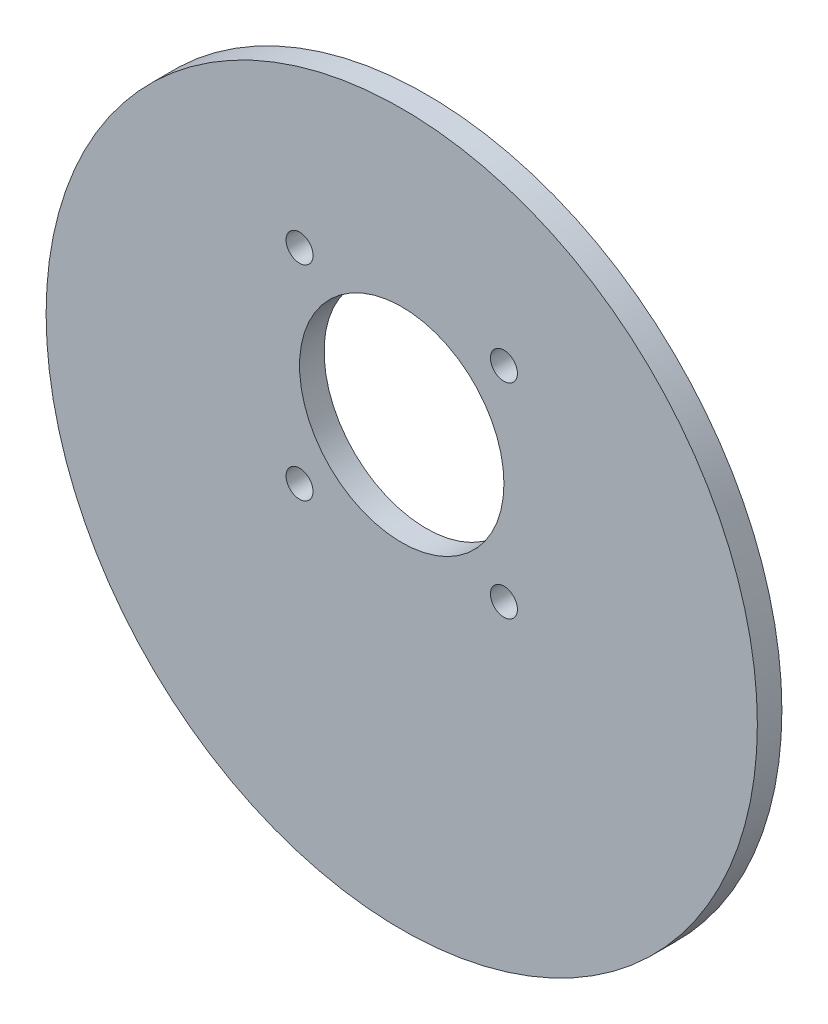
ISO-10303-21;
HEADER;
FILE_DESCRIPTION(('STEP AP214'),'2;1');
FILE_NAME('part.step','',(''),(''),'','','');
FILE_SCHEMA(('AUTOMOTIVE_DESIGN { 1 0 10303 214 1 1 1 1 }'));
ENDSEC;
DATA;
#1=APPLICATION_CONTEXT('core data for automotive mechanical design processes');
#2=APPLICATION_PROTOCOL_DEFINITION('international standard','automotive_design',2000,#1);
#3=PRODUCT_CONTEXT('',#1,'mechanical');
#4=PRODUCT('Part','Part','',(#3));
#5=PRODUCT_RELATED_PRODUCT_CATEGORY('part','',(#4));
#6=PRODUCT_DEFINITION_FORMATION('','',#4);
#7=PRODUCT_DEFINITION_CONTEXT('part definition',#1,'design');
#8=PRODUCT_DEFINITION('design','',#6,#7);
#9=PRODUCT_DEFINITION_SHAPE('','',#8);
#10=(LENGTH_UNIT() NAMED_UNIT(*) SI_UNIT(.MILLI.,.METRE.));
#11=(NAMED_UNIT(*) PLANE_ANGLE_UNIT() SI_UNIT($,.RADIAN.));
#12=(NAMED_UNIT(*) SI_UNIT($,.STERADIAN.) SOLID_ANGLE_UNIT());
#13=UNCERTAINTY_MEASURE_WITH_UNIT(LENGTH_MEASURE(1.E-05),#10,'distance_accuracy_value','');
#14=(GEOMETRIC_REPRESENTATION_CONTEXT(3) GLOBAL_UNCERTAINTY_ASSIGNED_CONTEXT((#13)) GLOBAL_UNIT_ASSIGNED_CONTEXT((#10,
#11,#12)) REPRESENTATION_CONTEXT('',''));
#15=CARTESIAN_POINT('',(0.,0.,0.));
#16=DIRECTION('',(0.,0.,1.));
#17=DIRECTION('',(1.,0.,0.));
#18=AXIS2_PLACEMENT_3D('',#15,#16,#17);
#19=CARTESIAN_POINT('',(0.,0.,3.));
#20=DIRECTION('',(0.,0.,1.));
#21=DIRECTION('',(1.,0.,0.));
#22=AXIS2_PLACEMENT_3D('',#19,#20,#21);
#23=PLANE('',#22);
#24=CARTESIAN_POINT('',(-12.5,22.5,3.));
#25=DIRECTION('',(0.,0.,1.));
#26=DIRECTION('',(1.,0.,0.));
#27=AXIS2_PLACEMENT_3D('',#24,#25,#26);
#28=CIRCLE('',#27,1.64999999999998);
#29=CARTESIAN_POINT('',(-10.85,22.5,3.));
#30=VERTEX_POINT('',#29);
#31=EDGE_CURVE('E73',#30,#30,#28,.T.);
#32=ORIENTED_EDGE('',*,*,#31,.F.);
#33=EDGE_LOOP('',(#32));
#34=FACE_BOUND('',#33,.T.);
#35=CARTESIAN_POINT('',(12.5,-2.50000000000001,3.));
#36=DIRECTION('',(0.,0.,1.));
#37=DIRECTION('',(1.,0.,0.));
#38=AXIS2_PLACEMENT_3D('',#35,#36,#37);
#39=CIRCLE('',#38,1.65000000000001);
#40=CARTESIAN_POINT('',(14.15,-2.50000000000001,3.));
#41=VERTEX_POINT('',#40);
#42=EDGE_CURVE('E61',#41,#41,#39,.T.);
#43=ORIENTED_EDGE('',*,*,#42,.F.);
#44=EDGE_LOOP('',(#43));
#45=FACE_BOUND('',#44,.T.);
#46=CARTESIAN_POINT('',(0.,0.,3.));
#47=DIRECTION('',(0.,0.,1.));
#48=DIRECTION('',(1.,0.,0.));
#49=AXIS2_PLACEMENT_3D('',#46,#47,#48);
#50=CIRCLE('',#49,43.5);
#51=CARTESIAN_POINT('',(43.5,0.,3.));
#52=VERTEX_POINT('',#51);
#53=EDGE_CURVE('E12',#52,#52,#50,.T.);
#54=ORIENTED_EDGE('',*,*,#53,.T.);
#55=EDGE_LOOP('',(#54));
#56=FACE_BOUND('',#55,.T.);
#57=CARTESIAN_POINT('',(-12.5,-2.49999999999999,3.));
#58=DIRECTION('',(0.,0.,1.));
#59=DIRECTION('',(1.,0.,0.));
#60=AXIS2_PLACEMENT_3D('',#57,#58,#59);
#61=CIRCLE('',#60,1.65);
#62=CARTESIAN_POINT('',(-10.85,-2.49999999999999,3.));
#63=VERTEX_POINT('',#62);
#64=EDGE_CURVE('E56',#63,#63,#61,.T.);
#65=ORIENTED_EDGE('',*,*,#64,.F.);
#66=EDGE_LOOP('',(#65));
#67=FACE_BOUND('',#66,.T.);
#68=CARTESIAN_POINT('',(12.5,22.5,3.));
#69=DIRECTION('',(0.,0.,1.));
#70=DIRECTION('',(1.,0.,0.));
#71=AXIS2_PLACEMENT_3D('',#68,#69,#70);
#72=CIRCLE('',#71,1.65);
#73=CARTESIAN_POINT('',(14.15,22.5,3.));
#74=VERTEX_POINT('',#73);
#75=EDGE_CURVE('E67',#74,#74,#72,.T.);
#76=ORIENTED_EDGE('',*,*,#75,.F.);
#77=EDGE_LOOP('',(#76));
#78=FACE_BOUND('',#77,.T.);
#79=CARTESIAN_POINT('',(0.,10.,3.));
#80=DIRECTION('',(0.,0.,1.));
#81=DIRECTION('',(1.,0.,0.));
#82=AXIS2_PLACEMENT_3D('',#79,#80,#81);
#83=CIRCLE('',#82,12.5);
#84=CARTESIAN_POINT('',(12.5,10.,3.));
#85=VERTEX_POINT('',#84);
#86=EDGE_CURVE('E79',#85,#85,#83,.T.);
#87=ORIENTED_EDGE('',*,*,#86,.F.);
#88=EDGE_LOOP('',(#87));
#89=FACE_BOUND('',#88,.T.);
#90=ADVANCED_FACE('F45',(#34,#45,#56,#67,#78,#89),#23,.T.);
#91=CARTESIAN_POINT('',(0.,0.,0.));
#92=DIRECTION('',(0.,0.,1.));
#93=DIRECTION('',(1.,0.,0.));
#94=AXIS2_PLACEMENT_3D('',#91,#92,#93);
#95=PLANE('',#94);
#96=CARTESIAN_POINT('',(0.,0.,0.));
#97=DIRECTION('',(0.,0.,1.));
#98=DIRECTION('',(1.,0.,0.));
#99=AXIS2_PLACEMENT_3D('',#96,#97,#98);
#100=CIRCLE('',#99,43.5);
#101=CARTESIAN_POINT('',(43.5,0.,0.));
#102=VERTEX_POINT('',#101);
#103=EDGE_CURVE('E49',#102,#102,#100,.T.);
#104=ORIENTED_EDGE('',*,*,#103,.F.);
#105=EDGE_LOOP('',(#104));
#106=FACE_BOUND('',#105,.T.);
#107=CARTESIAN_POINT('',(-12.5,-2.49999999999999,0.));
#108=DIRECTION('',(0.,0.,1.));
#109=DIRECTION('',(1.,0.,0.));
#110=AXIS2_PLACEMENT_3D('',#107,#108,#109);
#111=CIRCLE('',#110,1.65);
#112=CARTESIAN_POINT('',(-10.85,-2.49999999999999,0.));
#113=VERTEX_POINT('',#112);
#114=EDGE_CURVE('E58',#113,#113,#111,.T.);
#115=ORIENTED_EDGE('',*,*,#114,.T.);
#116=EDGE_LOOP('',(#115));
#117=FACE_BOUND('',#116,.T.);
#118=CARTESIAN_POINT('',(12.5,-2.50000000000001,0.));
#119=DIRECTION('',(0.,0.,1.));
#120=DIRECTION('',(1.,0.,0.));
#121=AXIS2_PLACEMENT_3D('',#118,#119,#120);
#122=CIRCLE('',#121,1.65000000000001);
#123=CARTESIAN_POINT('',(14.15,-2.50000000000001,0.));
#124=VERTEX_POINT('',#123);
#125=EDGE_CURVE('E64',#124,#124,#122,.T.);
#126=ORIENTED_EDGE('',*,*,#125,.T.);
#127=EDGE_LOOP('',(#126));
#128=FACE_BOUND('',#127,.T.);
#129=CARTESIAN_POINT('',(12.5,22.5,0.));
#130=DIRECTION('',(0.,0.,1.));
#131=DIRECTION('',(1.,0.,0.));
#132=AXIS2_PLACEMENT_3D('',#129,#130,#131);
#133=CIRCLE('',#132,1.65);
#134=CARTESIAN_POINT('',(14.15,22.5,0.));
#135=VERTEX_POINT('',#134);
#136=EDGE_CURVE('E70',#135,#135,#133,.T.);
#137=ORIENTED_EDGE('',*,*,#136,.T.);
#138=EDGE_LOOP('',(#137));
#139=FACE_BOUND('',#138,.T.);
#140=CARTESIAN_POINT('',(-12.5,22.5,0.));
#141=DIRECTION('',(0.,0.,1.));
#142=DIRECTION('',(1.,0.,0.));
#143=AXIS2_PLACEMENT_3D('',#140,#141,#142);
#144=CIRCLE('',#143,1.64999999999998);
#145=CARTESIAN_POINT('',(-10.85,22.5,0.));
#146=VERTEX_POINT('',#145);
#147=EDGE_CURVE('E76',#146,#146,#144,.T.);
#148=ORIENTED_EDGE('',*,*,#147,.T.);
#149=EDGE_LOOP('',(#148));
#150=FACE_BOUND('',#149,.T.);
#151=CARTESIAN_POINT('',(0.,10.,0.));
#152=DIRECTION('',(0.,0.,1.));
#153=DIRECTION('',(1.,0.,0.));
#154=AXIS2_PLACEMENT_3D('',#151,#152,#153);
#155=CIRCLE('',#154,12.5);
#156=CARTESIAN_POINT('',(12.5,10.,0.));
#157=VERTEX_POINT('',#156);
#158=EDGE_CURVE('E82',#157,#157,#155,.T.);
#159=ORIENTED_EDGE('',*,*,#158,.T.);
#160=EDGE_LOOP('',(#159));
#161=FACE_BOUND('',#160,.T.);
#162=ADVANCED_FACE('F92',(#106,#117,#128,#139,#150,#161),#95,.F.);
#163=CARTESIAN_POINT('',(0.,0.,3.));
#164=DIRECTION('',(0.,0.,-1.));
#165=DIRECTION('',(-1.,0.,0.));
#166=AXIS2_PLACEMENT_3D('',#163,#164,#165);
#167=CYLINDRICAL_SURFACE('',#166,43.5);
#168=ORIENTED_EDGE('',*,*,#53,.F.);
#169=EDGE_LOOP('',(#168));
#170=FACE_BOUND('',#169,.T.);
#171=ORIENTED_EDGE('',*,*,#103,.T.);
#172=EDGE_LOOP('',(#171));
#173=FACE_BOUND('',#172,.T.);
#174=ADVANCED_FACE('F47',(#170,#173),#167,.T.);
#175=CARTESIAN_POINT('',(-12.5,-2.49999999999999,3.));
#176=DIRECTION('',(0.,0.,-1.));
#177=DIRECTION('',(-1.,0.,0.));
#178=AXIS2_PLACEMENT_3D('',#175,#176,#177);
#179=CYLINDRICAL_SURFACE('',#178,1.65);
#180=ORIENTED_EDGE('',*,*,#64,.T.);
#181=EDGE_LOOP('',(#180));
#182=FACE_BOUND('',#181,.T.);
#183=ORIENTED_EDGE('',*,*,#114,.F.);
#184=EDGE_LOOP('',(#183));
#185=FACE_BOUND('',#184,.T.);
#186=ADVANCED_FACE('F102',(#182,#185),#179,.F.);
#187=CARTESIAN_POINT('',(12.5,-2.50000000000001,3.));
#188=DIRECTION('',(0.,0.,-1.));
#189=DIRECTION('',(-1.,0.,0.));
#190=AXIS2_PLACEMENT_3D('',#187,#188,#189);
#191=CYLINDRICAL_SURFACE('',#190,1.65000000000001);
#192=ORIENTED_EDGE('',*,*,#42,.T.);
#193=EDGE_LOOP('',(#192));
#194=FACE_BOUND('',#193,.T.);
#195=ORIENTED_EDGE('',*,*,#125,.F.);
#196=EDGE_LOOP('',(#195));
#197=FACE_BOUND('',#196,.T.);
#198=ADVANCED_FACE('F105',(#194,#197),#191,.F.);
#199=CARTESIAN_POINT('',(12.5,22.5,3.));
#200=DIRECTION('',(0.,0.,-1.));
#201=DIRECTION('',(-1.,0.,0.));
#202=AXIS2_PLACEMENT_3D('',#199,#200,#201);
#203=CYLINDRICAL_SURFACE('',#202,1.65);
#204=ORIENTED_EDGE('',*,*,#75,.T.);
#205=EDGE_LOOP('',(#204));
#206=FACE_BOUND('',#205,.T.);
#207=ORIENTED_EDGE('',*,*,#136,.F.);
#208=EDGE_LOOP('',(#207));
#209=FACE_BOUND('',#208,.T.);
#210=ADVANCED_FACE('F109',(#206,#209),#203,.F.);
#211=CARTESIAN_POINT('',(-12.5,22.5,3.));
#212=DIRECTION('',(0.,0.,-1.));
#213=DIRECTION('',(-1.,0.,0.));
#214=AXIS2_PLACEMENT_3D('',#211,#212,#213);
#215=CYLINDRICAL_SURFACE('',#214,1.64999999999998);
#216=ORIENTED_EDGE('',*,*,#31,.T.);
#217=EDGE_LOOP('',(#216));
#218=FACE_BOUND('',#217,.T.);
#219=ORIENTED_EDGE('',*,*,#147,.F.);
#220=EDGE_LOOP('',(#219));
#221=FACE_BOUND('',#220,.T.);
#222=ADVANCED_FACE('F113',(#218,#221),#215,.F.);
#223=CARTESIAN_POINT('',(0.,10.,3.));
#224=DIRECTION('',(0.,0.,-1.));
#225=DIRECTION('',(-1.,0.,0.));
#226=AXIS2_PLACEMENT_3D('',#223,#224,#225);
#227=CYLINDRICAL_SURFACE('',#226,12.5);
#228=ORIENTED_EDGE('',*,*,#86,.T.);
#229=EDGE_LOOP('',(#228));
#230=FACE_BOUND('',#229,.T.);
#231=ORIENTED_EDGE('',*,*,#158,.F.);
#232=EDGE_LOOP('',(#231));
#233=FACE_BOUND('',#232,.T.);
#234=ADVANCED_FACE('F88',(#230,#233),#227,.F.);
#235=CLOSED_SHELL('',(#90,#162,#174,#186,#198,#210,#222,#234));
#236=MANIFOLD_SOLID_BREP('B2',#235);
#237=ADVANCED_BREP_SHAPE_REPRESENTATION('',(#18,#236),#14);
#238=SHAPE_DEFINITION_REPRESENTATION(#9,#237);
ENDSEC;
END-ISO-10303-21;
